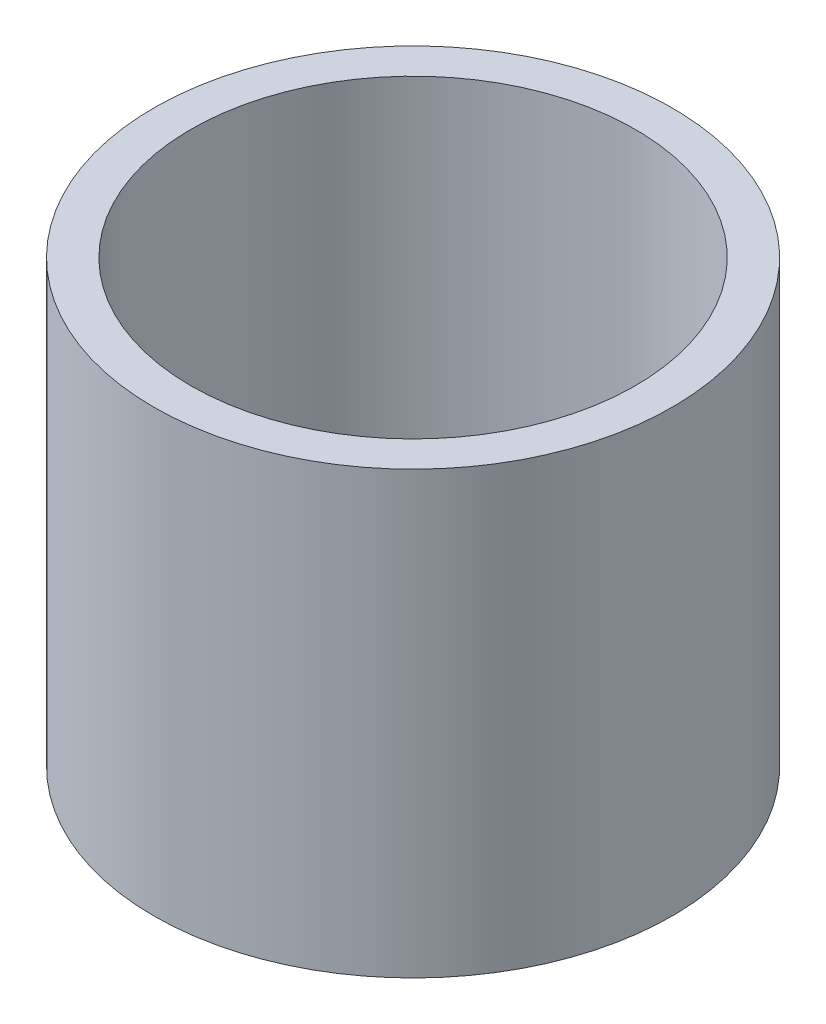
ISO-10303-21;
HEADER;
FILE_DESCRIPTION(('STEP AP214'),'2;1');
FILE_NAME('part.step','',(''),(''),'','','');
FILE_SCHEMA(('AUTOMOTIVE_DESIGN { 1 0 10303 214 1 1 1 1 }'));
ENDSEC;
DATA;
#1=APPLICATION_CONTEXT('core data for automotive mechanical design processes');
#2=APPLICATION_PROTOCOL_DEFINITION('international standard','automotive_design',2000,#1);
#3=PRODUCT_CONTEXT('',#1,'mechanical');
#4=PRODUCT('Part','Part','',(#3));
#5=PRODUCT_RELATED_PRODUCT_CATEGORY('part','',(#4));
#6=PRODUCT_DEFINITION_FORMATION('','',#4);
#7=PRODUCT_DEFINITION_CONTEXT('part definition',#1,'design');
#8=PRODUCT_DEFINITION('design','',#6,#7);
#9=PRODUCT_DEFINITION_SHAPE('','',#8);
#10=(LENGTH_UNIT() NAMED_UNIT(*) SI_UNIT(.MILLI.,.METRE.));
#11=(NAMED_UNIT(*) PLANE_ANGLE_UNIT() SI_UNIT($,.RADIAN.));
#12=(NAMED_UNIT(*) SI_UNIT($,.STERADIAN.) SOLID_ANGLE_UNIT());
#13=UNCERTAINTY_MEASURE_WITH_UNIT(LENGTH_MEASURE(1.E-05),#10,'distance_accuracy_value','');
#14=(GEOMETRIC_REPRESENTATION_CONTEXT(3) GLOBAL_UNCERTAINTY_ASSIGNED_CONTEXT((#13)) GLOBAL_UNIT_ASSIGNED_CONTEXT((#10,
#11,#12)) REPRESENTATION_CONTEXT('',''));
#15=CARTESIAN_POINT('',(0.,0.,0.));
#16=DIRECTION('',(0.,0.,1.));
#17=DIRECTION('',(1.,0.,0.));
#18=AXIS2_PLACEMENT_3D('',#15,#16,#17);
#19=CARTESIAN_POINT('',(0.,59.5,0.));
#20=DIRECTION('',(0.,-1.,0.));
#21=DIRECTION('',(0.,0.,-1.));
#22=AXIS2_PLACEMENT_3D('',#19,#20,#21);
#23=CYLINDRICAL_SURFACE('',#22,35.);
#24=CARTESIAN_POINT('',(0.,59.5,0.));
#25=DIRECTION('',(0.,1.,0.));
#26=DIRECTION('',(0.,0.,1.));
#27=AXIS2_PLACEMENT_3D('',#24,#25,#26);
#28=CIRCLE('',#27,35.);
#29=CARTESIAN_POINT('',(0.,59.5,35.));
#30=VERTEX_POINT('',#29);
#31=EDGE_CURVE('E10',#30,#30,#28,.T.);
#32=ORIENTED_EDGE('',*,*,#31,.F.);
#33=EDGE_LOOP('',(#32));
#34=FACE_BOUND('',#33,.T.);
#35=CARTESIAN_POINT('',(0.,0.,0.));
#36=DIRECTION('',(0.,1.,0.));
#37=DIRECTION('',(0.,0.,1.));
#38=AXIS2_PLACEMENT_3D('',#35,#36,#37);
#39=CIRCLE('',#38,35.);
#40=CARTESIAN_POINT('',(0.,0.,35.));
#41=VERTEX_POINT('',#40);
#42=EDGE_CURVE('E40',#41,#41,#39,.T.);
#43=ORIENTED_EDGE('',*,*,#42,.T.);
#44=EDGE_LOOP('',(#43));
#45=FACE_BOUND('',#44,.T.);
#46=ADVANCED_FACE('F33',(#34,#45),#23,.T.);
#47=CARTESIAN_POINT('',(0.,59.5,0.));
#48=DIRECTION('',(0.,1.,0.));
#49=DIRECTION('',(0.,0.,1.));
#50=AXIS2_PLACEMENT_3D('',#47,#48,#49);
#51=PLANE('',#50);
#52=CARTESIAN_POINT('',(0.,59.5,0.));
#53=DIRECTION('',(0.,1.,0.));
#54=DIRECTION('',(0.,0.,1.));
#55=AXIS2_PLACEMENT_3D('',#52,#53,#54);
#56=CIRCLE('',#55,30.);
#57=CARTESIAN_POINT('',(0.,59.5,30.));
#58=VERTEX_POINT('',#57);
#59=EDGE_CURVE('E36',#58,#58,#56,.F.);
#60=ORIENTED_EDGE('',*,*,#59,.T.);
#61=EDGE_LOOP('',(#60));
#62=FACE_BOUND('',#61,.T.);
#63=ORIENTED_EDGE('',*,*,#31,.T.);
#64=EDGE_LOOP('',(#63));
#65=FACE_BOUND('',#64,.T.);
#66=ADVANCED_FACE('F53',(#62,#65),#51,.T.);
#67=CARTESIAN_POINT('',(0.,0.,0.));
#68=DIRECTION('',(0.,1.,0.));
#69=DIRECTION('',(0.,0.,1.));
#70=AXIS2_PLACEMENT_3D('',#67,#68,#69);
#71=PLANE('',#70);
#72=ORIENTED_EDGE('',*,*,#42,.F.);
#73=EDGE_LOOP('',(#72));
#74=FACE_BOUND('',#73,.T.);
#75=ADVANCED_FACE('F59',(#74),#71,.F.);
#76=CARTESIAN_POINT('',(0.,64.,0.));
#77=DIRECTION('',(0.,-1.,0.));
#78=DIRECTION('',(0.,0.,-1.));
#79=AXIS2_PLACEMENT_3D('',#76,#77,#78);
#80=CYLINDRICAL_SURFACE('',#79,30.);
#81=ORIENTED_EDGE('',*,*,#59,.F.);
#82=EDGE_LOOP('',(#81));
#83=FACE_BOUND('',#82,.T.);
#84=CARTESIAN_POINT('',(0.,5.,0.));
#85=DIRECTION('',(0.,1.,0.));
#86=DIRECTION('',(0.,0.,1.));
#87=AXIS2_PLACEMENT_3D('',#84,#85,#86);
#88=CIRCLE('',#87,30.);
#89=CARTESIAN_POINT('',(0.,5.,30.));
#90=VERTEX_POINT('',#89);
#91=EDGE_CURVE('E46',#90,#90,#88,.T.);
#92=ORIENTED_EDGE('',*,*,#91,.F.);
#93=EDGE_LOOP('',(#92));
#94=FACE_BOUND('',#93,.T.);
#95=ADVANCED_FACE('F55',(#83,#94),#80,.F.);
#96=CARTESIAN_POINT('',(0.,5.,0.));
#97=DIRECTION('',(0.,1.,0.));
#98=DIRECTION('',(0.,0.,1.));
#99=AXIS2_PLACEMENT_3D('',#96,#97,#98);
#100=PLANE('',#99);
#101=ORIENTED_EDGE('',*,*,#91,.T.);
#102=EDGE_LOOP('',(#101));
#103=FACE_BOUND('',#102,.T.);
#104=ADVANCED_FACE('F58',(#103),#100,.T.);
#105=CLOSED_SHELL('',(#46,#66,#75,#95,#104));
#106=MANIFOLD_SOLID_BREP('B2',#105);
#107=ADVANCED_BREP_SHAPE_REPRESENTATION('',(#18,#106),#14);
#108=SHAPE_DEFINITION_REPRESENTATION(#9,#107);
ENDSEC;
END-ISO-10303-21;
